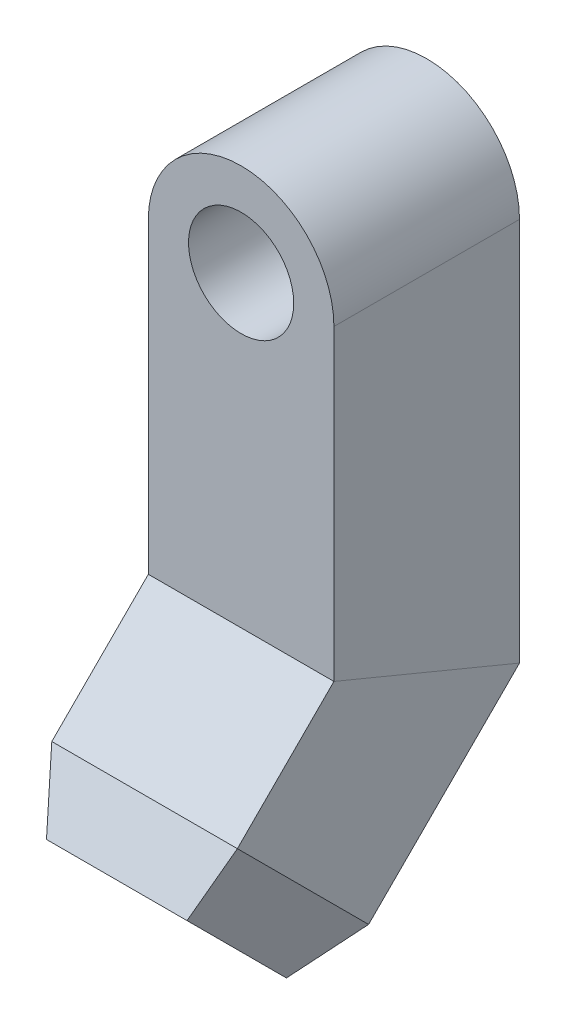
ISO-10303-21;
HEADER;
FILE_DESCRIPTION(('STEP AP214'),'2;1');
FILE_NAME('part.step','',(''),(''),'','','');
FILE_SCHEMA(('AUTOMOTIVE_DESIGN { 1 0 10303 214 1 1 1 1 }'));
ENDSEC;
DATA;
#1=APPLICATION_CONTEXT('core data for automotive mechanical design processes');
#2=APPLICATION_PROTOCOL_DEFINITION('international standard','automotive_design',2000,#1);
#3=PRODUCT_CONTEXT('',#1,'mechanical');
#4=PRODUCT('Part','Part','',(#3));
#5=PRODUCT_RELATED_PRODUCT_CATEGORY('part','',(#4));
#6=PRODUCT_DEFINITION_FORMATION('','',#4);
#7=PRODUCT_DEFINITION_CONTEXT('part definition',#1,'design');
#8=PRODUCT_DEFINITION('design','',#6,#7);
#9=PRODUCT_DEFINITION_SHAPE('','',#8);
#10=(LENGTH_UNIT() NAMED_UNIT(*) SI_UNIT(.MILLI.,.METRE.));
#11=(NAMED_UNIT(*) PLANE_ANGLE_UNIT() SI_UNIT($,.RADIAN.));
#12=(NAMED_UNIT(*) SI_UNIT($,.STERADIAN.) SOLID_ANGLE_UNIT());
#13=UNCERTAINTY_MEASURE_WITH_UNIT(LENGTH_MEASURE(1.E-05),#10,'distance_accuracy_value','');
#14=(GEOMETRIC_REPRESENTATION_CONTEXT(3) GLOBAL_UNCERTAINTY_ASSIGNED_CONTEXT((#13)) GLOBAL_UNIT_ASSIGNED_CONTEXT((#10,
#11,#12)) REPRESENTATION_CONTEXT('',''));
#15=CARTESIAN_POINT('',(0.,0.,0.));
#16=DIRECTION('',(0.,0.,1.));
#17=DIRECTION('',(1.,0.,0.));
#18=AXIS2_PLACEMENT_3D('',#15,#16,#17);
#19=CARTESIAN_POINT('',(19.05,45.0786722599583,7.26209610324912));
#20=DIRECTION('',(-1.,0.,0.));
#21=DIRECTION('',(0.,0.,1.));
#22=AXIS2_PLACEMENT_3D('',#19,#20,#21);
#23=PLANE('',#22);
#24=DIRECTION('',(0.,0.382683432365091,0.923879532511287));
#25=VECTOR('',#24,1.);
#26=CARTESIAN_POINT('',(19.05,42.5318762324136,41.3600079491902));
#27=LINE('',#26,#25);
#28=CARTESIAN_POINT('',(19.05,17.5092316367925,-19.05));
#29=VERTEX_POINT('',#28);
#30=CARTESIAN_POINT('',(19.05,33.2907683632075,19.05));
#31=VERTEX_POINT('',#30);
#32=EDGE_CURVE('E113',#29,#31,#27,.T.);
#33=ORIENTED_EDGE('',*,*,#32,.T.);
#34=DIRECTION('',(0.,-0.707106781186546,0.707106781186549));
#35=VECTOR('',#34,1.);
#36=CARTESIAN_POINT('',(19.05,45.0786722599583,7.26209610324912));
#37=LINE('',#36,#35);
#38=CARTESIAN_POINT('',(19.05,13.4703841816038,38.8703841816038));
#39=VERTEX_POINT('',#38);
#40=EDGE_CURVE('E49',#31,#39,#37,.T.);
#41=ORIENTED_EDGE('',*,*,#40,.T.);
#42=DIRECTION('',(0.,-0.707106781186549,-0.707106781186546));
#43=VECTOR('',#42,1.);
#44=CARTESIAN_POINT('',(19.05,13.4703841816038,38.8703841816038));
#45=LINE('',#44,#43);
#46=CARTESIAN_POINT('',(19.05,-13.4703841816038,11.9296158183964));
#47=VERTEX_POINT('',#46);
#48=EDGE_CURVE('E203',#39,#47,#45,.T.);
#49=ORIENTED_EDGE('',*,*,#48,.T.);
#50=DIRECTION('',(0.,-0.707106781186546,0.707106781186549));
#51=VECTOR('',#50,1.);
#52=CARTESIAN_POINT('',(19.05,18.1379038967508,-19.6786722599583));
#53=LINE('',#52,#51);
#54=EDGE_CURVE('E214',#29,#47,#53,.T.);
#55=ORIENTED_EDGE('',*,*,#54,.F.);
#56=EDGE_LOOP('',(#33,#41,#49,#55));
#57=FACE_BOUND('',#56,.T.);
#58=ADVANCED_FACE('F45',(#57),#23,.F.);
#59=CARTESIAN_POINT('',(-19.05,18.1379038967508,-19.6786722599583));
#60=DIRECTION('',(0.,0.707106781186549,0.707106781186546));
#61=DIRECTION('',(0.,-0.707106781186546,0.707106781186549));
#62=AXIS2_PLACEMENT_3D('',#59,#60,#61);
#63=PLANE('',#62);
#64=DIRECTION('',(1.,0.,0.));
#65=VECTOR('',#64,1.);
#66=CARTESIAN_POINT('',(-19.05,17.5092316367925,-19.05));
#67=LINE('',#66,#65);
#68=CARTESIAN_POINT('',(-19.05,17.5092316367925,-19.05));
#69=VERTEX_POINT('',#68);
#70=EDGE_CURVE('E11',#69,#29,#67,.T.);
#71=ORIENTED_EDGE('',*,*,#70,.T.);
#72=ORIENTED_EDGE('',*,*,#54,.T.);
#73=DIRECTION('',(-1.,0.,0.));
#74=VECTOR('',#73,1.);
#75=CARTESIAN_POINT('',(-19.05,-13.4703841816038,11.9296158183964));
#76=LINE('',#75,#74);
#77=CARTESIAN_POINT('',(-19.05,-13.4703841816038,11.9296158183964));
#78=VERTEX_POINT('',#77);
#79=EDGE_CURVE('E199',#47,#78,#76,.T.);
#80=ORIENTED_EDGE('',*,*,#79,.T.);
#81=DIRECTION('',(0.,-0.707106781186546,0.707106781186549));
#82=VECTOR('',#81,1.);
#83=CARTESIAN_POINT('',(-19.05,18.1379038967508,-19.6786722599583));
#84=LINE('',#83,#82);
#85=EDGE_CURVE('E211',#69,#78,#84,.T.);
#86=ORIENTED_EDGE('',*,*,#85,.F.);
#87=EDGE_LOOP('',(#71,#72,#80,#86));
#88=FACE_BOUND('',#87,.T.);
#89=ADVANCED_FACE('F236',(#88),#63,.F.);
#90=CARTESIAN_POINT('',(-19.05,45.0786722599583,7.26209610324912));
#91=DIRECTION('',(1.,0.,0.));
#92=DIRECTION('',(0.,0.,-1.));
#93=AXIS2_PLACEMENT_3D('',#90,#91,#92);
#94=PLANE('',#93);
#95=DIRECTION('',(0.,-0.382683432365091,-0.923879532511287));
#96=VECTOR('',#95,1.);
#97=CARTESIAN_POINT('',(-19.05,42.5318762324136,41.3600079491902));
#98=LINE('',#97,#96);
#99=CARTESIAN_POINT('',(-19.05,33.2907683632075,19.05));
#100=VERTEX_POINT('',#99);
#101=EDGE_CURVE('E56',#100,#69,#98,.T.);
#102=ORIENTED_EDGE('',*,*,#101,.T.);
#103=ORIENTED_EDGE('',*,*,#85,.T.);
#104=DIRECTION('',(0.,0.707106781186549,0.707106781186546));
#105=VECTOR('',#104,1.);
#106=CARTESIAN_POINT('',(-19.05,13.4703841816038,38.8703841816038));
#107=LINE('',#106,#105);
#108=CARTESIAN_POINT('',(-19.05,13.4703841816038,38.8703841816038));
#109=VERTEX_POINT('',#108);
#110=EDGE_CURVE('E195',#78,#109,#107,.T.);
#111=ORIENTED_EDGE('',*,*,#110,.T.);
#112=DIRECTION('',(0.,-0.707106781186546,0.707106781186549));
#113=VECTOR('',#112,1.);
#114=CARTESIAN_POINT('',(-19.05,45.0786722599583,7.26209610324912));
#115=LINE('',#114,#113);
#116=EDGE_CURVE('E207',#100,#109,#115,.T.);
#117=ORIENTED_EDGE('',*,*,#116,.F.);
#118=EDGE_LOOP('',(#102,#103,#111,#117));
#119=FACE_BOUND('',#118,.T.);
#120=ADVANCED_FACE('F235',(#119),#94,.F.);
#121=CARTESIAN_POINT('',(-19.05,45.0786722599583,7.26209610324912));
#122=DIRECTION('',(0.,-0.707106781186549,-0.707106781186546));
#123=DIRECTION('',(0.,0.707106781186546,-0.707106781186549));
#124=AXIS2_PLACEMENT_3D('',#121,#122,#123);
#125=PLANE('',#124);
#126=DIRECTION('',(-1.,0.,0.));
#127=VECTOR('',#126,1.);
#128=CARTESIAN_POINT('',(-19.05,33.2907683632075,19.05));
#129=LINE('',#128,#127);
#130=EDGE_CURVE('E176',#31,#100,#129,.T.);
#131=ORIENTED_EDGE('',*,*,#130,.T.);
#132=ORIENTED_EDGE('',*,*,#116,.T.);
#133=DIRECTION('',(1.,0.,0.));
#134=VECTOR('',#133,1.);
#135=CARTESIAN_POINT('',(-19.05,13.4703841816038,38.8703841816038));
#136=LINE('',#135,#134);
#137=EDGE_CURVE('E148',#109,#39,#136,.T.);
#138=ORIENTED_EDGE('',*,*,#137,.T.);
#139=ORIENTED_EDGE('',*,*,#40,.F.);
#140=EDGE_LOOP('',(#131,#132,#138,#139));
#141=FACE_BOUND('',#140,.T.);
#142=ADVANCED_FACE('F47',(#141),#125,.F.);
#143=CARTESIAN_POINT('',(-19.05,96.393,19.05));
#144=DIRECTION('',(0.,0.,-1.));
#145=DIRECTION('',(0.,1.,0.));
#146=AXIS2_PLACEMENT_3D('',#143,#144,#145);
#147=PLANE('',#146);
#148=CARTESIAN_POINT('',(0.,96.393,19.05));
#149=DIRECTION('',(0.,0.,1.));
#150=DIRECTION('',(1.,0.,0.));
#151=AXIS2_PLACEMENT_3D('',#148,#149,#150);
#152=CIRCLE('',#151,10.795);
#153=CARTESIAN_POINT('',(10.795,96.393,19.05));
#154=VERTEX_POINT('',#153);
#155=EDGE_CURVE('E141',#154,#154,#152,.T.);
#156=ORIENTED_EDGE('',*,*,#155,.F.);
#157=EDGE_LOOP('',(#156));
#158=FACE_BOUND('',#157,.T.);
#159=DIRECTION('',(0.,-1.,0.));
#160=VECTOR('',#159,1.);
#161=CARTESIAN_POINT('',(19.05,96.393,19.05));
#162=LINE('',#161,#160);
#163=CARTESIAN_POINT('',(19.05,96.393,19.05));
#164=VERTEX_POINT('',#163);
#165=EDGE_CURVE('E118',#164,#31,#162,.T.);
#166=ORIENTED_EDGE('',*,*,#165,.F.);
#167=CARTESIAN_POINT('',(0.,96.393,19.05));
#168=DIRECTION('',(0.,0.,-1.));
#169=DIRECTION('',(0.,1.,0.));
#170=AXIS2_PLACEMENT_3D('',#167,#168,#169);
#171=CIRCLE('',#170,19.05);
#172=CARTESIAN_POINT('',(-19.05,96.393,19.05));
#173=VERTEX_POINT('',#172);
#174=EDGE_CURVE('E127',#164,#173,#171,.F.);
#175=ORIENTED_EDGE('',*,*,#174,.T.);
#176=DIRECTION('',(0.,-1.,0.));
#177=VECTOR('',#176,1.);
#178=CARTESIAN_POINT('',(-19.05,96.393,19.05));
#179=LINE('',#178,#177);
#180=EDGE_CURVE('E184',#173,#100,#179,.T.);
#181=ORIENTED_EDGE('',*,*,#180,.T.);
#182=ORIENTED_EDGE('',*,*,#130,.F.);
#183=EDGE_LOOP('',(#166,#175,#181,#182));
#184=FACE_BOUND('',#183,.T.);
#185=ADVANCED_FACE('F266',(#158,#184),#147,.F.);
#186=CARTESIAN_POINT('',(-19.05,96.393,19.05));
#187=DIRECTION('',(1.,0.,0.));
#188=DIRECTION('',(0.,0.,-1.));
#189=AXIS2_PLACEMENT_3D('',#186,#187,#188);
#190=PLANE('',#189);
#191=ORIENTED_EDGE('',*,*,#180,.F.);
#192=DIRECTION('',(0.,0.,1.));
#193=VECTOR('',#192,1.);
#194=CARTESIAN_POINT('',(-19.05,96.393,19.05));
#195=LINE('',#194,#193);
#196=CARTESIAN_POINT('',(-19.05,96.393,-19.05));
#197=VERTEX_POINT('',#196);
#198=EDGE_CURVE('E129',#197,#173,#195,.T.);
#199=ORIENTED_EDGE('',*,*,#198,.F.);
#200=DIRECTION('',(0.,-1.,0.));
#201=VECTOR('',#200,1.);
#202=CARTESIAN_POINT('',(-19.05,96.393,-19.05));
#203=LINE('',#202,#201);
#204=EDGE_CURVE('E117',#197,#69,#203,.T.);
#205=ORIENTED_EDGE('',*,*,#204,.T.);
#206=ORIENTED_EDGE('',*,*,#101,.F.);
#207=EDGE_LOOP('',(#191,#199,#205,#206));
#208=FACE_BOUND('',#207,.T.);
#209=ADVANCED_FACE('F261',(#208),#190,.F.);
#210=CARTESIAN_POINT('',(-19.05,96.393,-19.05));
#211=DIRECTION('',(0.,0.,1.));
#212=DIRECTION('',(0.,-1.,0.));
#213=AXIS2_PLACEMENT_3D('',#210,#211,#212);
#214=PLANE('',#213);
#215=CARTESIAN_POINT('',(0.,96.393,-19.05));
#216=DIRECTION('',(0.,0.,1.));
#217=DIRECTION('',(1.,0.,0.));
#218=AXIS2_PLACEMENT_3D('',#215,#216,#217);
#219=CIRCLE('',#218,10.795);
#220=CARTESIAN_POINT('',(10.795,96.393,-19.05));
#221=VERTEX_POINT('',#220);
#222=EDGE_CURVE('E134',#221,#221,#219,.T.);
#223=ORIENTED_EDGE('',*,*,#222,.T.);
#224=EDGE_LOOP('',(#223));
#225=FACE_BOUND('',#224,.T.);
#226=ORIENTED_EDGE('',*,*,#204,.F.);
#227=CARTESIAN_POINT('',(0.,96.393,-19.05));
#228=DIRECTION('',(0.,0.,-1.));
#229=DIRECTION('',(0.,1.,0.));
#230=AXIS2_PLACEMENT_3D('',#227,#228,#229);
#231=CIRCLE('',#230,19.05);
#232=CARTESIAN_POINT('',(19.05,96.393,-19.05));
#233=VERTEX_POINT('',#232);
#234=EDGE_CURVE('E125',#197,#233,#231,.T.);
#235=ORIENTED_EDGE('',*,*,#234,.T.);
#236=DIRECTION('',(0.,-1.,0.));
#237=VECTOR('',#236,1.);
#238=CARTESIAN_POINT('',(19.05,96.393,-19.05));
#239=LINE('',#238,#237);
#240=EDGE_CURVE('E106',#233,#29,#239,.T.);
#241=ORIENTED_EDGE('',*,*,#240,.T.);
#242=ORIENTED_EDGE('',*,*,#70,.F.);
#243=EDGE_LOOP('',(#226,#235,#241,#242));
#244=FACE_BOUND('',#243,.T.);
#245=ADVANCED_FACE('F131',(#225,#244),#214,.F.);
#246=CARTESIAN_POINT('',(19.05,96.393,19.05));
#247=DIRECTION('',(-1.,0.,0.));
#248=DIRECTION('',(0.,0.,1.));
#249=AXIS2_PLACEMENT_3D('',#246,#247,#248);
#250=PLANE('',#249);
#251=ORIENTED_EDGE('',*,*,#240,.F.);
#252=DIRECTION('',(0.,0.,-1.));
#253=VECTOR('',#252,1.);
#254=CARTESIAN_POINT('',(19.05,96.393,19.05));
#255=LINE('',#254,#253);
#256=EDGE_CURVE('E110',#164,#233,#255,.T.);
#257=ORIENTED_EDGE('',*,*,#256,.F.);
#258=ORIENTED_EDGE('',*,*,#165,.T.);
#259=ORIENTED_EDGE('',*,*,#32,.F.);
#260=EDGE_LOOP('',(#251,#257,#258,#259));
#261=FACE_BOUND('',#260,.T.);
#262=ADVANCED_FACE('F108',(#261),#250,.F.);
#263=CARTESIAN_POINT('',(-19.05,-13.4703841816038,11.9296158183964));
#264=DIRECTION('',(0.,-0.906307787036651,-0.422618261740697));
#265=DIRECTION('',(0.,0.422618261740697,-0.906307787036651));
#266=AXIS2_PLACEMENT_3D('',#263,#264,#265);
#267=PLANE('',#266);
#268=ORIENTED_EDGE('',*,*,#79,.F.);
#269=DIRECTION('',(0.323615577118185,0.399876601840004,-0.857538139995741));
#270=VECTOR('',#269,1.);
#271=CARTESIAN_POINT('',(19.05,-13.4703841816038,11.9296158183964));
#272=LINE('',#271,#270);
#273=CARTESIAN_POINT('',(14.4275780248192,-19.1820943785168,24.1784178636216));
#274=VERTEX_POINT('',#273);
#275=EDGE_CURVE('E145',#274,#47,#272,.T.);
#276=ORIENTED_EDGE('',*,*,#275,.F.);
#277=DIRECTION('',(-1.,0.,0.));
#278=VECTOR('',#277,1.);
#279=CARTESIAN_POINT('',(-19.05,-19.1820943785168,24.1784178636216));
#280=LINE('',#279,#278);
#281=CARTESIAN_POINT('',(-14.4275780248192,-19.1820943785168,24.1784178636216));
#282=VERTEX_POINT('',#281);
#283=EDGE_CURVE('E138',#282,#274,#280,.F.);
#284=ORIENTED_EDGE('',*,*,#283,.F.);
#285=DIRECTION('',(-0.323615577118185,0.399876601840004,-0.857538139995741));
#286=VECTOR('',#285,1.);
#287=CARTESIAN_POINT('',(-19.05,-13.4703841816038,11.9296158183964));
#288=LINE('',#287,#286);
#289=EDGE_CURVE('E150',#282,#78,#288,.T.);
#290=ORIENTED_EDGE('',*,*,#289,.T.);
#291=EDGE_LOOP('',(#268,#276,#284,#290));
#292=FACE_BOUND('',#291,.T.);
#293=ADVANCED_FACE('F240',(#292),#267,.T.);
#294=CARTESIAN_POINT('',(19.05,-13.4703841816038,11.9296158183964));
#295=DIRECTION('',(0.939692620785908,-0.241844762647975,0.241844762647976));
#296=DIRECTION('',(0.249243569363955,0.,-0.968440830991091));
#297=AXIS2_PLACEMENT_3D('',#294,#295,#296);
#298=PLANE('',#297);
#299=ORIENTED_EDGE('',*,*,#48,.F.);
#300=DIRECTION('',(0.323615577118185,0.857538139995739,-0.399876601840008));
#301=VECTOR('',#300,1.);
#302=CARTESIAN_POINT('',(19.05,13.4703841816038,38.8703841816038));
#303=LINE('',#302,#301);
#304=CARTESIAN_POINT('',(14.4275780248192,1.22158213637858,44.5820943785169));
#305=VERTEX_POINT('',#304);
#306=EDGE_CURVE('E149',#305,#39,#303,.T.);
#307=ORIENTED_EDGE('',*,*,#306,.F.);
#308=DIRECTION('',(0.,-0.707106781186549,-0.707106781186546));
#309=VECTOR('',#308,1.);
#310=CARTESIAN_POINT('',(14.4275780248192,-22.4506403026729,20.9098719394655));
#311=LINE('',#310,#309);
#312=EDGE_CURVE('E165',#274,#305,#311,.F.);
#313=ORIENTED_EDGE('',*,*,#312,.F.);
#314=ORIENTED_EDGE('',*,*,#275,.T.);
#315=EDGE_LOOP('',(#299,#307,#313,#314));
#316=FACE_BOUND('',#315,.T.);
#317=ADVANCED_FACE('F245',(#316),#298,.T.);
#318=CARTESIAN_POINT('',(19.05,13.4703841816038,38.8703841816038));
#319=DIRECTION('',(0.,0.4226182617407,0.906307787036649));
#320=DIRECTION('',(0.,-0.90630778703665,0.4226182617407));
#321=AXIS2_PLACEMENT_3D('',#318,#319,#320);
#322=PLANE('',#321);
#323=ORIENTED_EDGE('',*,*,#137,.F.);
#324=DIRECTION('',(-0.323615577118185,0.857538139995739,-0.399876601840008));
#325=VECTOR('',#324,1.);
#326=CARTESIAN_POINT('',(-19.05,13.4703841816038,38.8703841816038));
#327=LINE('',#326,#325);
#328=CARTESIAN_POINT('',(-14.4275780248192,1.22158213637858,44.5820943785169));
#329=VERTEX_POINT('',#328);
#330=EDGE_CURVE('E154',#329,#109,#327,.T.);
#331=ORIENTED_EDGE('',*,*,#330,.F.);
#332=DIRECTION('',(1.,0.,0.));
#333=VECTOR('',#332,1.);
#334=CARTESIAN_POINT('',(19.05,1.22158213637857,44.5820943785169));
#335=LINE('',#334,#333);
#336=EDGE_CURVE('E168',#305,#329,#335,.F.);
#337=ORIENTED_EDGE('',*,*,#336,.F.);
#338=ORIENTED_EDGE('',*,*,#306,.T.);
#339=EDGE_LOOP('',(#323,#331,#337,#338));
#340=FACE_BOUND('',#339,.T.);
#341=ADVANCED_FACE('F227',(#340),#322,.T.);
#342=CARTESIAN_POINT('',(-19.05,13.4703841816038,38.8703841816038));
#343=DIRECTION('',(-0.939692620785908,-0.241844762647975,0.241844762647976));
#344=DIRECTION('',(0.249243569363955,0.,0.968440830991091));
#345=AXIS2_PLACEMENT_3D('',#342,#343,#344);
#346=PLANE('',#345);
#347=ORIENTED_EDGE('',*,*,#110,.F.);
#348=ORIENTED_EDGE('',*,*,#289,.F.);
#349=DIRECTION('',(0.,0.707106781186549,0.707106781186546));
#350=VECTOR('',#349,1.);
#351=CARTESIAN_POINT('',(-14.4275780248192,4.49012806053463,47.850640302673));
#352=LINE('',#351,#350);
#353=EDGE_CURVE('E155',#329,#282,#352,.F.);
#354=ORIENTED_EDGE('',*,*,#353,.F.);
#355=ORIENTED_EDGE('',*,*,#330,.T.);
#356=EDGE_LOOP('',(#347,#348,#354,#355));
#357=FACE_BOUND('',#356,.T.);
#358=ADVANCED_FACE('F232',(#357),#346,.T.);
#359=CARTESIAN_POINT('',(0.,-21.6802561210692,21.6802561210693));
#360=DIRECTION('',(0.,-0.707106781186546,0.707106781186549));
#361=DIRECTION('',(0.,-0.707106781186549,-0.707106781186546));
#362=AXIS2_PLACEMENT_3D('',#359,#360,#361);
#363=PLANE('',#362);
#364=CARTESIAN_POINT('',(0.,-8.98025612106913,34.3802561210692));
#365=DIRECTION('',(0.,-0.707106781186546,0.707106781186549));
#366=DIRECTION('',(0.,-0.707106781186549,-0.707106781186546));
#367=AXIS2_PLACEMENT_3D('',#364,#365,#366);
#368=CIRCLE('',#367,10.795);
#369=CARTESIAN_POINT('',(0.,-16.6134738239779,26.7470384181605));
#370=VERTEX_POINT('',#369);
#371=EDGE_CURVE('E377',#370,#370,#368,.T.);
#372=ORIENTED_EDGE('',*,*,#371,.F.);
#373=EDGE_LOOP('',(#372));
#374=FACE_BOUND('',#373,.T.);
#375=ORIENTED_EDGE('',*,*,#283,.T.);
#376=ORIENTED_EDGE('',*,*,#312,.T.);
#377=ORIENTED_EDGE('',*,*,#336,.T.);
#378=ORIENTED_EDGE('',*,*,#353,.T.);
#379=EDGE_LOOP('',(#375,#376,#377,#378));
#380=FACE_BOUND('',#379,.T.);
#381=ADVANCED_FACE('F243',(#374,#380),#363,.T.);
#382=CARTESIAN_POINT('',(0.,96.393,61.647094971371));
#383=DIRECTION('',(0.,0.,-1.));
#384=DIRECTION('',(0.,1.,0.));
#385=AXIS2_PLACEMENT_3D('',#382,#383,#384);
#386=CYLINDRICAL_SURFACE('',#385,19.05);
#387=ORIENTED_EDGE('',*,*,#174,.F.);
#388=ORIENTED_EDGE('',*,*,#256,.T.);
#389=ORIENTED_EDGE('',*,*,#234,.F.);
#390=ORIENTED_EDGE('',*,*,#198,.T.);
#391=EDGE_LOOP('',(#387,#388,#389,#390));
#392=FACE_BOUND('',#391,.T.);
#393=ADVANCED_FACE('F123',(#392),#386,.T.);
#394=CARTESIAN_POINT('',(0.,96.393,-19.05));
#395=DIRECTION('',(0.,0.,1.));
#396=DIRECTION('',(1.,0.,0.));
#397=AXIS2_PLACEMENT_3D('',#394,#395,#396);
#398=CYLINDRICAL_SURFACE('',#397,10.795);
#399=CARTESIAN_POINT('',(10.795,96.393,-19.05));
#400=CARTESIAN_POINT('',(10.795,96.393,-18.653125));
#401=CARTESIAN_POINT('',(10.795,96.393,-18.25625));
#402=CARTESIAN_POINT('',(10.795,96.393,-17.4625));
#403=CARTESIAN_POINT('',(10.795,96.393,-17.065625));
#404=CARTESIAN_POINT('',(10.795,96.393,-16.271875));
#405=CARTESIAN_POINT('',(10.795,96.393,-15.875));
#406=CARTESIAN_POINT('',(10.795,96.393,-15.08125));
#407=CARTESIAN_POINT('',(10.795,96.393,-14.684375));
#408=CARTESIAN_POINT('',(10.795,96.393,-13.890625));
#409=CARTESIAN_POINT('',(10.795,96.393,-13.49375));
#410=CARTESIAN_POINT('',(10.795,96.393,-12.7));
#411=CARTESIAN_POINT('',(10.795,96.393,-12.303125));
#412=CARTESIAN_POINT('',(10.795,96.393,-11.509375));
#413=CARTESIAN_POINT('',(10.795,96.393,-11.1125));
#414=CARTESIAN_POINT('',(10.795,96.393,-10.31875));
#415=CARTESIAN_POINT('',(10.795,96.393,-9.92187500000001));
#416=CARTESIAN_POINT('',(10.795,96.393,-9.12812500000001));
#417=CARTESIAN_POINT('',(10.795,96.393,-8.73125000000001));
#418=CARTESIAN_POINT('',(10.795,96.393,-7.93750000000001));
#419=CARTESIAN_POINT('',(10.795,96.393,-7.54062500000001));
#420=CARTESIAN_POINT('',(10.795,96.393,-6.74687500000001));
#421=CARTESIAN_POINT('',(10.795,96.393,-6.35000000000001));
#422=CARTESIAN_POINT('',(10.795,96.393,-5.55625000000001));
#423=CARTESIAN_POINT('',(10.795,96.393,-5.15937500000001));
#424=CARTESIAN_POINT('',(10.795,96.393,-4.36562500000001));
#425=CARTESIAN_POINT('',(10.795,96.393,-3.96875000000001));
#426=CARTESIAN_POINT('',(10.795,96.393,-3.17500000000001));
#427=CARTESIAN_POINT('',(10.795,96.393,-2.77812500000001));
#428=CARTESIAN_POINT('',(10.795,96.393,-1.98437500000001));
#429=CARTESIAN_POINT('',(10.795,96.393,-1.58750000000001));
#430=CARTESIAN_POINT('',(10.795,96.393,-0.793750000000011));
#431=CARTESIAN_POINT('',(10.795,96.393,-0.396875000000011));
#432=CARTESIAN_POINT('',(10.795,96.393,0.39687499999999));
#433=CARTESIAN_POINT('',(10.795,96.393,0.79374999999999));
#434=CARTESIAN_POINT('',(10.795,96.393,1.58749999999999));
#435=CARTESIAN_POINT('',(10.795,96.393,1.98437499999999));
#436=CARTESIAN_POINT('',(10.795,96.393,2.77812499999999));
#437=CARTESIAN_POINT('',(10.795,96.393,3.17499999999999));
#438=CARTESIAN_POINT('',(10.795,96.393,3.96874999999999));
#439=CARTESIAN_POINT('',(10.795,96.393,4.36562499999999));
#440=CARTESIAN_POINT('',(10.795,96.393,5.15937499999999));
#441=CARTESIAN_POINT('',(10.795,96.393,5.55624999999999));
#442=CARTESIAN_POINT('',(10.795,96.393,6.34999999999999));
#443=CARTESIAN_POINT('',(10.795,96.393,6.74687499999999));
#444=CARTESIAN_POINT('',(10.795,96.393,7.54062499999999));
#445=CARTESIAN_POINT('',(10.795,96.393,7.93749999999999));
#446=CARTESIAN_POINT('',(10.795,96.393,8.73124999999999));
#447=CARTESIAN_POINT('',(10.795,96.393,9.12812499999999));
#448=CARTESIAN_POINT('',(10.795,96.393,9.92187499999999));
#449=CARTESIAN_POINT('',(10.795,96.393,10.31875));
#450=CARTESIAN_POINT('',(10.795,96.393,11.1125));
#451=CARTESIAN_POINT('',(10.795,96.393,11.509375));
#452=CARTESIAN_POINT('',(10.795,96.393,12.303125));
#453=CARTESIAN_POINT('',(10.795,96.393,12.7));
#454=CARTESIAN_POINT('',(10.795,96.393,13.49375));
#455=CARTESIAN_POINT('',(10.795,96.393,13.890625));
#456=CARTESIAN_POINT('',(10.795,96.393,14.684375));
#457=CARTESIAN_POINT('',(10.795,96.393,15.08125));
#458=CARTESIAN_POINT('',(10.795,96.393,15.875));
#459=CARTESIAN_POINT('',(10.795,96.393,16.271875));
#460=CARTESIAN_POINT('',(10.795,96.393,17.065625));
#461=CARTESIAN_POINT('',(10.795,96.393,17.4625));
#462=CARTESIAN_POINT('',(10.795,96.393,18.25625));
#463=CARTESIAN_POINT('',(10.795,96.393,18.653125));
#464=CARTESIAN_POINT('',(10.795,96.393,19.05));
#465=B_SPLINE_CURVE_WITH_KNOTS('',3,(#399,#400,#401,#402,#403,#404,#405,#406,#407,#408,#409,
#410,#411,#412,#413,#414,#415,#416,#417,#418,#419,#420,#421,#422,#423,#424,#425,#426,#427,#428,
#429,#430,#431,#432,#433,#434,#435,#436,#437,#438,#439,#440,#441,#442,#443,#444,#445,#446,#447,
#448,#449,#450,#451,#452,#453,#454,#455,#456,#457,#458,#459,#460,#461,#462,#463,#464),
.UNSPECIFIED.,.F.,.F.,(4,2,2,2,2,2,2,2,2,2,2,2,2,2,2,2,2,2,2,2,2,2,2,2,2,2,2,2,2,2,2,2,4),(0.,
1.190625,2.38125,3.571875,4.7625,5.953125,7.14375,8.334375,9.525,10.715625,11.90625,13.096875,
14.2875,15.478125,16.66875,17.859375,19.05,20.240625,21.43125,22.621875,23.8125,25.003125,
26.19375,27.384375,28.575,29.765625,30.95625,32.146875,33.3375,34.528125,35.71875,36.909375,
38.1),.UNSPECIFIED.);
#466=EDGE_CURVE('BSEAM343',#221,#154,#465,.T.);
#467=ORIENTED_EDGE('',*,*,#222,.F.);
#468=ORIENTED_EDGE('',*,*,#155,.T.);
#469=ORIENTED_EDGE('',*,*,#466,.T.);
#470=ORIENTED_EDGE('',*,*,#466,.F.);
#471=EDGE_LOOP('',(#467,#469,#468,#470));
#472=FACE_BOUND('',#471,.T.);
#473=ADVANCED_FACE('F343',(#472),#398,.F.);
#474=CARTESIAN_POINT('',(0.,0.,25.4000000000001));
#475=DIRECTION('',(0.,-0.707106781186546,0.707106781186549));
#476=DIRECTION('',(0.,-0.707106781186549,-0.707106781186546));
#477=AXIS2_PLACEMENT_3D('',#474,#475,#476);
#478=CYLINDRICAL_SURFACE('',#477,10.795);
#479=CARTESIAN_POINT('',(0.,0.,25.4000000000001));
#480=DIRECTION('',(0.,-0.707106781186546,0.707106781186549));
#481=DIRECTION('',(0.,-0.707106781186549,-0.707106781186546));
#482=AXIS2_PLACEMENT_3D('',#479,#480,#481);
#483=CIRCLE('',#482,10.795);
#484=CARTESIAN_POINT('',(0.,-7.63321770290879,17.7667822970913));
#485=VERTEX_POINT('',#484);
#486=EDGE_CURVE('E375',#485,#485,#483,.T.);
#487=ORIENTED_EDGE('',*,*,#486,.F.);
#488=EDGE_LOOP('',(#487));
#489=FACE_BOUND('',#488,.T.);
#490=ORIENTED_EDGE('',*,*,#371,.T.);
#491=EDGE_LOOP('',(#490));
#492=FACE_BOUND('',#491,.T.);
#493=ADVANCED_FACE('F351',(#489,#492),#478,.F.);
#494=CARTESIAN_POINT('',(0.,0.,25.4000000000001));
#495=DIRECTION('',(0.,-0.707106781186546,0.707106781186549));
#496=DIRECTION('',(0.,-0.707106781186549,-0.707106781186546));
#497=AXIS2_PLACEMENT_3D('',#494,#495,#496);
#498=PLANE('',#497);
#499=ORIENTED_EDGE('',*,*,#486,.T.);
#500=EDGE_LOOP('',(#499));
#501=FACE_BOUND('',#500,.T.);
#502=ADVANCED_FACE('F360',(#501),#498,.T.);
#503=CLOSED_SHELL('',(#58,#89,#120,#142,#185,#209,#245,#262,#293,#317,#341,#358,#381,#393,#473,
#493,#502));
#504=MANIFOLD_SOLID_BREP('B2',#503);
#505=ADVANCED_BREP_SHAPE_REPRESENTATION('',(#18,#504),#14);
#506=SHAPE_DEFINITION_REPRESENTATION(#9,#505);
ENDSEC;
END-ISO-10303-21;
